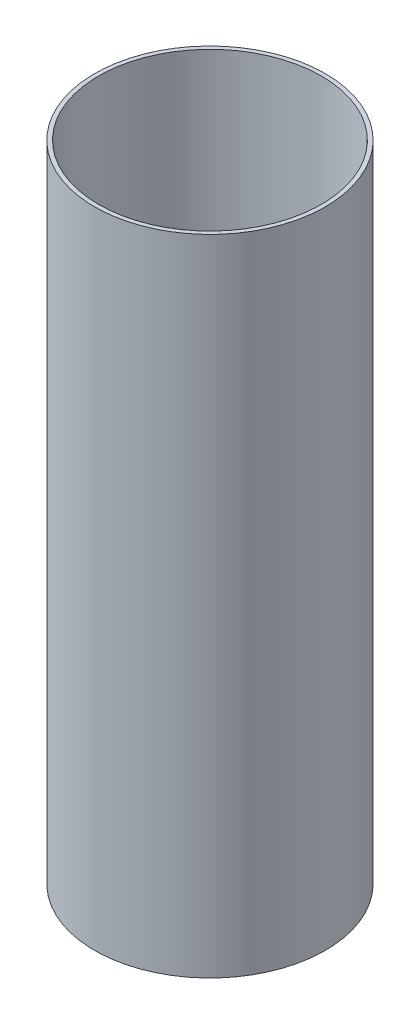
ISO-10303-21;
HEADER;
FILE_DESCRIPTION(('STEP AP214'),'2;1');
FILE_NAME('part.step','',(''),(''),'','','');
FILE_SCHEMA(('AUTOMOTIVE_DESIGN { 1 0 10303 214 1 1 1 1 }'));
ENDSEC;
DATA;
#1=APPLICATION_CONTEXT('core data for automotive mechanical design processes');
#2=APPLICATION_PROTOCOL_DEFINITION('international standard','automotive_design',2000,#1);
#3=PRODUCT_CONTEXT('',#1,'mechanical');
#4=PRODUCT('Part','Part','',(#3));
#5=PRODUCT_RELATED_PRODUCT_CATEGORY('part','',(#4));
#6=PRODUCT_DEFINITION_FORMATION('','',#4);
#7=PRODUCT_DEFINITION_CONTEXT('part definition',#1,'design');
#8=PRODUCT_DEFINITION('design','',#6,#7);
#9=PRODUCT_DEFINITION_SHAPE('','',#8);
#10=(LENGTH_UNIT() NAMED_UNIT(*) SI_UNIT(.MILLI.,.METRE.));
#11=(NAMED_UNIT(*) PLANE_ANGLE_UNIT() SI_UNIT($,.RADIAN.));
#12=(NAMED_UNIT(*) SI_UNIT($,.STERADIAN.) SOLID_ANGLE_UNIT());
#13=UNCERTAINTY_MEASURE_WITH_UNIT(LENGTH_MEASURE(1.E-05),#10,'distance_accuracy_value','');
#14=(GEOMETRIC_REPRESENTATION_CONTEXT(3) GLOBAL_UNCERTAINTY_ASSIGNED_CONTEXT((#13)) GLOBAL_UNIT_ASSIGNED_CONTEXT((#10,
#11,#12)) REPRESENTATION_CONTEXT('',''));
#15=CARTESIAN_POINT('',(0.,0.,0.));
#16=DIRECTION('',(0.,0.,1.));
#17=DIRECTION('',(1.,0.,0.));
#18=AXIS2_PLACEMENT_3D('',#15,#16,#17);
#19=CARTESIAN_POINT('',(0.,152.4,0.));
#20=DIRECTION('',(0.,1.,0.));
#21=DIRECTION('',(0.,0.,1.));
#22=AXIS2_PLACEMENT_3D('',#19,#20,#21);
#23=PLANE('',#22);
#24=CARTESIAN_POINT('',(0.,152.4,0.));
#25=DIRECTION('',(0.,1.,0.));
#26=DIRECTION('',(0.,0.,1.));
#27=AXIS2_PLACEMENT_3D('',#24,#25,#26);
#28=CIRCLE('',#27,27.305);
#29=CARTESIAN_POINT('',(0.,152.4,-27.305));
#30=VERTEX_POINT('',#29);
#31=EDGE_CURVE('E10',#30,#30,#28,.T.);
#32=ORIENTED_EDGE('',*,*,#31,.T.);
#33=EDGE_LOOP('',(#32));
#34=FACE_BOUND('',#33,.T.);
#35=CARTESIAN_POINT('',(0.,152.4,0.));
#36=DIRECTION('',(0.,1.,0.));
#37=DIRECTION('',(0.,0.,1.));
#38=AXIS2_PLACEMENT_3D('',#35,#36,#37);
#39=CIRCLE('',#38,26.35);
#40=CARTESIAN_POINT('',(0.,152.4,-26.35));
#41=VERTEX_POINT('',#40);
#42=EDGE_CURVE('E46',#41,#41,#39,.T.);
#43=ORIENTED_EDGE('',*,*,#42,.F.);
#44=EDGE_LOOP('',(#43));
#45=FACE_BOUND('',#44,.T.);
#46=ADVANCED_FACE('F35',(#34,#45),#23,.T.);
#47=CARTESIAN_POINT('',(0.,0.,0.));
#48=DIRECTION('',(0.,1.,0.));
#49=DIRECTION('',(0.,0.,1.));
#50=AXIS2_PLACEMENT_3D('',#47,#48,#49);
#51=PLANE('',#50);
#52=CARTESIAN_POINT('',(0.,0.,0.));
#53=DIRECTION('',(0.,1.,0.));
#54=DIRECTION('',(0.,0.,1.));
#55=AXIS2_PLACEMENT_3D('',#52,#53,#54);
#56=CIRCLE('',#55,27.305);
#57=CARTESIAN_POINT('',(0.,0.,-27.305));
#58=VERTEX_POINT('',#57);
#59=EDGE_CURVE('E39',#58,#58,#56,.T.);
#60=ORIENTED_EDGE('',*,*,#59,.F.);
#61=EDGE_LOOP('',(#60));
#62=FACE_BOUND('',#61,.T.);
#63=CARTESIAN_POINT('',(0.,0.,0.));
#64=DIRECTION('',(0.,1.,0.));
#65=DIRECTION('',(0.,0.,1.));
#66=AXIS2_PLACEMENT_3D('',#63,#64,#65);
#67=CIRCLE('',#66,26.35);
#68=CARTESIAN_POINT('',(0.,0.,-26.35));
#69=VERTEX_POINT('',#68);
#70=EDGE_CURVE('E48',#69,#69,#67,.T.);
#71=ORIENTED_EDGE('',*,*,#70,.T.);
#72=EDGE_LOOP('',(#71));
#73=FACE_BOUND('',#72,.T.);
#74=ADVANCED_FACE('F58',(#62,#73),#51,.F.);
#75=CARTESIAN_POINT('',(0.,152.4,0.));
#76=DIRECTION('',(0.,-1.,0.));
#77=DIRECTION('',(0.,0.,-1.));
#78=AXIS2_PLACEMENT_3D('',#75,#76,#77);
#79=CYLINDRICAL_SURFACE('',#78,27.305);
#80=CARTESIAN_POINT('',(0.,152.4,-27.305));
#81=CARTESIAN_POINT('',(0.,150.8125,-27.305));
#82=CARTESIAN_POINT('',(0.,149.225,-27.305));
#83=CARTESIAN_POINT('',(0.,146.05,-27.305));
#84=CARTESIAN_POINT('',(0.,144.4625,-27.305));
#85=CARTESIAN_POINT('',(0.,141.2875,-27.305));
#86=CARTESIAN_POINT('',(0.,139.7,-27.305));
#87=CARTESIAN_POINT('',(0.,136.525,-27.305));
#88=CARTESIAN_POINT('',(0.,134.9375,-27.305));
#89=CARTESIAN_POINT('',(0.,131.7625,-27.305));
#90=CARTESIAN_POINT('',(0.,130.175,-27.305));
#91=CARTESIAN_POINT('',(0.,127.,-27.305));
#92=CARTESIAN_POINT('',(0.,125.4125,-27.305));
#93=CARTESIAN_POINT('',(0.,122.2375,-27.305));
#94=CARTESIAN_POINT('',(0.,120.65,-27.305));
#95=CARTESIAN_POINT('',(0.,117.475,-27.305));
#96=CARTESIAN_POINT('',(0.,115.8875,-27.305));
#97=CARTESIAN_POINT('',(0.,112.7125,-27.305));
#98=CARTESIAN_POINT('',(0.,111.125,-27.305));
#99=CARTESIAN_POINT('',(0.,107.95,-27.305));
#100=CARTESIAN_POINT('',(0.,106.3625,-27.305));
#101=CARTESIAN_POINT('',(0.,103.1875,-27.305));
#102=CARTESIAN_POINT('',(0.,101.6,-27.305));
#103=CARTESIAN_POINT('',(0.,98.425,-27.305));
#104=CARTESIAN_POINT('',(0.,96.8375,-27.305));
#105=CARTESIAN_POINT('',(0.,93.6625,-27.305));
#106=CARTESIAN_POINT('',(0.,92.075,-27.305));
#107=CARTESIAN_POINT('',(0.,88.9,-27.305));
#108=CARTESIAN_POINT('',(0.,87.3125,-27.305));
#109=CARTESIAN_POINT('',(0.,84.1375,-27.305));
#110=CARTESIAN_POINT('',(0.,82.55,-27.305));
#111=CARTESIAN_POINT('',(0.,79.375,-27.305));
#112=CARTESIAN_POINT('',(0.,77.7875,-27.305));
#113=CARTESIAN_POINT('',(0.,74.6125,-27.305));
#114=CARTESIAN_POINT('',(0.,73.025,-27.305));
#115=CARTESIAN_POINT('',(0.,69.85,-27.305));
#116=CARTESIAN_POINT('',(0.,68.2625,-27.305));
#117=CARTESIAN_POINT('',(0.,65.0875,-27.305));
#118=CARTESIAN_POINT('',(0.,63.5,-27.305));
#119=CARTESIAN_POINT('',(0.,60.325,-27.305));
#120=CARTESIAN_POINT('',(0.,58.7375,-27.305));
#121=CARTESIAN_POINT('',(0.,55.5625,-27.305));
#122=CARTESIAN_POINT('',(0.,53.975,-27.305));
#123=CARTESIAN_POINT('',(0.,50.8,-27.305));
#124=CARTESIAN_POINT('',(0.,49.2125,-27.305));
#125=CARTESIAN_POINT('',(0.,46.0375,-27.305));
#126=CARTESIAN_POINT('',(0.,44.45,-27.305));
#127=CARTESIAN_POINT('',(0.,41.275,-27.305));
#128=CARTESIAN_POINT('',(0.,39.6875,-27.305));
#129=CARTESIAN_POINT('',(0.,36.5125,-27.305));
#130=CARTESIAN_POINT('',(0.,34.925,-27.305));
#131=CARTESIAN_POINT('',(0.,31.75,-27.305));
#132=CARTESIAN_POINT('',(0.,30.1625,-27.305));
#133=CARTESIAN_POINT('',(0.,26.9875,-27.305));
#134=CARTESIAN_POINT('',(0.,25.4,-27.305));
#135=CARTESIAN_POINT('',(0.,22.225,-27.305));
#136=CARTESIAN_POINT('',(0.,20.6375,-27.305));
#137=CARTESIAN_POINT('',(0.,17.4625,-27.305));
#138=CARTESIAN_POINT('',(0.,15.875,-27.305));
#139=CARTESIAN_POINT('',(0.,12.7,-27.305));
#140=CARTESIAN_POINT('',(0.,11.1125,-27.305));
#141=CARTESIAN_POINT('',(0.,7.93750000000001,-27.305));
#142=CARTESIAN_POINT('',(0.,6.35,-27.305));
#143=CARTESIAN_POINT('',(0.,3.175,-27.305));
#144=CARTESIAN_POINT('',(0.,1.5875,-27.305));
#145=CARTESIAN_POINT('',(0.,0.,-27.305));
#146=B_SPLINE_CURVE_WITH_KNOTS('',3,(#80,#81,#82,#83,#84,#85,#86,#87,#88,#89,#90,#91,#92,#93,
#94,#95,#96,#97,#98,#99,#100,#101,#102,#103,#104,#105,#106,#107,#108,#109,#110,#111,#112,#113,
#114,#115,#116,#117,#118,#119,#120,#121,#122,#123,#124,#125,#126,#127,#128,#129,#130,#131,#132,
#133,#134,#135,#136,#137,#138,#139,#140,#141,#142,#143,#144,#145),.UNSPECIFIED.,.F.,.F.,(4,2,2,
2,2,2,2,2,2,2,2,2,2,2,2,2,2,2,2,2,2,2,2,2,2,2,2,2,2,2,2,2,4),(0.,4.7625,9.52500000000001,
14.2875,19.05,23.8125,28.575,33.3375,38.1,42.8625,47.625,52.3875,57.15,61.9125,66.675,71.4375,
76.2,80.9625,85.725,90.4875,95.25,100.0125,104.775,109.5375,114.3,119.0625,123.825,128.5875,
133.35,138.1125,142.875,147.6375,152.4),.UNSPECIFIED.);
#147=EDGE_CURVE('BSEAM37',#30,#58,#146,.T.);
#148=ORIENTED_EDGE('',*,*,#31,.F.);
#149=ORIENTED_EDGE('',*,*,#59,.T.);
#150=ORIENTED_EDGE('',*,*,#147,.T.);
#151=ORIENTED_EDGE('',*,*,#147,.F.);
#152=EDGE_LOOP('',(#148,#150,#149,#151));
#153=FACE_BOUND('',#152,.T.);
#154=ADVANCED_FACE('F37',(#153),#79,.T.);
#155=CARTESIAN_POINT('',(0.,152.4,0.));
#156=DIRECTION('',(0.,-1.,0.));
#157=DIRECTION('',(0.,0.,-1.));
#158=AXIS2_PLACEMENT_3D('',#155,#156,#157);
#159=CYLINDRICAL_SURFACE('',#158,26.35);
#160=CARTESIAN_POINT('',(0.,152.4,-26.35));
#161=CARTESIAN_POINT('',(0.,150.8125,-26.35));
#162=CARTESIAN_POINT('',(0.,149.225,-26.35));
#163=CARTESIAN_POINT('',(0.,146.05,-26.35));
#164=CARTESIAN_POINT('',(0.,144.4625,-26.35));
#165=CARTESIAN_POINT('',(0.,141.2875,-26.35));
#166=CARTESIAN_POINT('',(0.,139.7,-26.35));
#167=CARTESIAN_POINT('',(0.,136.525,-26.35));
#168=CARTESIAN_POINT('',(0.,134.9375,-26.35));
#169=CARTESIAN_POINT('',(0.,131.7625,-26.35));
#170=CARTESIAN_POINT('',(0.,130.175,-26.35));
#171=CARTESIAN_POINT('',(0.,127.,-26.35));
#172=CARTESIAN_POINT('',(0.,125.4125,-26.35));
#173=CARTESIAN_POINT('',(0.,122.2375,-26.35));
#174=CARTESIAN_POINT('',(0.,120.65,-26.35));
#175=CARTESIAN_POINT('',(0.,117.475,-26.35));
#176=CARTESIAN_POINT('',(0.,115.8875,-26.35));
#177=CARTESIAN_POINT('',(0.,112.7125,-26.35));
#178=CARTESIAN_POINT('',(0.,111.125,-26.35));
#179=CARTESIAN_POINT('',(0.,107.95,-26.35));
#180=CARTESIAN_POINT('',(0.,106.3625,-26.35));
#181=CARTESIAN_POINT('',(0.,103.1875,-26.35));
#182=CARTESIAN_POINT('',(0.,101.6,-26.35));
#183=CARTESIAN_POINT('',(0.,98.425,-26.35));
#184=CARTESIAN_POINT('',(0.,96.8375,-26.35));
#185=CARTESIAN_POINT('',(0.,93.6625,-26.35));
#186=CARTESIAN_POINT('',(0.,92.075,-26.35));
#187=CARTESIAN_POINT('',(0.,88.9,-26.35));
#188=CARTESIAN_POINT('',(0.,87.3125,-26.35));
#189=CARTESIAN_POINT('',(0.,84.1375,-26.35));
#190=CARTESIAN_POINT('',(0.,82.55,-26.35));
#191=CARTESIAN_POINT('',(0.,79.375,-26.35));
#192=CARTESIAN_POINT('',(0.,77.7875,-26.35));
#193=CARTESIAN_POINT('',(0.,74.6125,-26.35));
#194=CARTESIAN_POINT('',(0.,73.025,-26.35));
#195=CARTESIAN_POINT('',(0.,69.85,-26.35));
#196=CARTESIAN_POINT('',(0.,68.2625,-26.35));
#197=CARTESIAN_POINT('',(0.,65.0875,-26.35));
#198=CARTESIAN_POINT('',(0.,63.5,-26.35));
#199=CARTESIAN_POINT('',(0.,60.325,-26.35));
#200=CARTESIAN_POINT('',(0.,58.7375,-26.35));
#201=CARTESIAN_POINT('',(0.,55.5625,-26.35));
#202=CARTESIAN_POINT('',(0.,53.975,-26.35));
#203=CARTESIAN_POINT('',(0.,50.8,-26.35));
#204=CARTESIAN_POINT('',(0.,49.2125,-26.35));
#205=CARTESIAN_POINT('',(0.,46.0375,-26.35));
#206=CARTESIAN_POINT('',(0.,44.45,-26.35));
#207=CARTESIAN_POINT('',(0.,41.275,-26.35));
#208=CARTESIAN_POINT('',(0.,39.6875,-26.35));
#209=CARTESIAN_POINT('',(0.,36.5125,-26.35));
#210=CARTESIAN_POINT('',(0.,34.925,-26.35));
#211=CARTESIAN_POINT('',(0.,31.75,-26.35));
#212=CARTESIAN_POINT('',(0.,30.1625,-26.35));
#213=CARTESIAN_POINT('',(0.,26.9875,-26.35));
#214=CARTESIAN_POINT('',(0.,25.4,-26.35));
#215=CARTESIAN_POINT('',(0.,22.225,-26.35));
#216=CARTESIAN_POINT('',(0.,20.6375,-26.35));
#217=CARTESIAN_POINT('',(0.,17.4625,-26.35));
#218=CARTESIAN_POINT('',(0.,15.875,-26.35));
#219=CARTESIAN_POINT('',(0.,12.7,-26.35));
#220=CARTESIAN_POINT('',(0.,11.1125,-26.35));
#221=CARTESIAN_POINT('',(0.,7.93750000000001,-26.35));
#222=CARTESIAN_POINT('',(0.,6.35,-26.35));
#223=CARTESIAN_POINT('',(0.,3.175,-26.35));
#224=CARTESIAN_POINT('',(0.,1.5875,-26.35));
#225=CARTESIAN_POINT('',(0.,0.,-26.35));
#226=B_SPLINE_CURVE_WITH_KNOTS('',3,(#160,#161,#162,#163,#164,#165,#166,#167,#168,#169,#170,
#171,#172,#173,#174,#175,#176,#177,#178,#179,#180,#181,#182,#183,#184,#185,#186,#187,#188,#189,
#190,#191,#192,#193,#194,#195,#196,#197,#198,#199,#200,#201,#202,#203,#204,#205,#206,#207,#208,
#209,#210,#211,#212,#213,#214,#215,#216,#217,#218,#219,#220,#221,#222,#223,#224,#225),
.UNSPECIFIED.,.F.,.F.,(4,2,2,2,2,2,2,2,2,2,2,2,2,2,2,2,2,2,2,2,2,2,2,2,2,2,2,2,2,2,2,2,4),(0.,
4.76249999999998,9.52499999999998,14.2875,19.05,23.8125,28.575,33.3375,38.1,42.8625,47.625,
52.3875,57.15,61.9125,66.675,71.4375,76.2,80.9625,85.725,90.4875,95.25,100.0125,104.775,
109.5375,114.3,119.0625,123.825,128.5875,133.35,138.1125,142.875,147.6375,152.4),.UNSPECIFIED.);
#227=EDGE_CURVE('BSEAM54',#41,#69,#226,.T.);
#228=ORIENTED_EDGE('',*,*,#42,.T.);
#229=ORIENTED_EDGE('',*,*,#70,.F.);
#230=ORIENTED_EDGE('',*,*,#227,.T.);
#231=ORIENTED_EDGE('',*,*,#227,.F.);
#232=EDGE_LOOP('',(#228,#230,#229,#231));
#233=FACE_BOUND('',#232,.T.);
#234=ADVANCED_FACE('F54',(#233),#159,.F.);
#235=CLOSED_SHELL('',(#46,#74,#154,#234));
#236=MANIFOLD_SOLID_BREP('B2',#235);
#237=ADVANCED_BREP_SHAPE_REPRESENTATION('',(#18,#236),#14);
#238=SHAPE_DEFINITION_REPRESENTATION(#9,#237);
ENDSEC;
END-ISO-10303-21;
